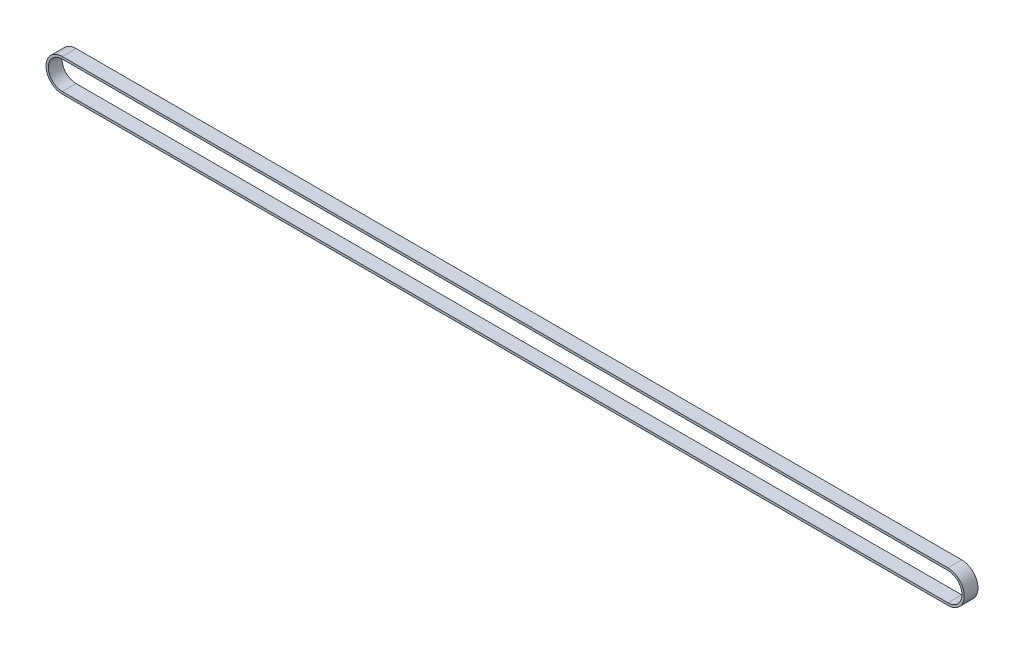
ISO-10303-21;
HEADER;
FILE_DESCRIPTION(('STEP AP214'),'2;1');
FILE_NAME('part.step','',(''),(''),'','','');
FILE_SCHEMA(('AUTOMOTIVE_DESIGN { 1 0 10303 214 1 1 1 1 }'));
ENDSEC;
DATA;
#1=APPLICATION_CONTEXT('core data for automotive mechanical design processes');
#2=APPLICATION_PROTOCOL_DEFINITION('international standard','automotive_design',2000,#1);
#3=PRODUCT_CONTEXT('',#1,'mechanical');
#4=PRODUCT('Part','Part','',(#3));
#5=PRODUCT_RELATED_PRODUCT_CATEGORY('part','',(#4));
#6=PRODUCT_DEFINITION_FORMATION('','',#4);
#7=PRODUCT_DEFINITION_CONTEXT('part definition',#1,'design');
#8=PRODUCT_DEFINITION('design','',#6,#7);
#9=PRODUCT_DEFINITION_SHAPE('','',#8);
#10=(LENGTH_UNIT() NAMED_UNIT(*) SI_UNIT(.MILLI.,.METRE.));
#11=(NAMED_UNIT(*) PLANE_ANGLE_UNIT() SI_UNIT($,.RADIAN.));
#12=(NAMED_UNIT(*) SI_UNIT($,.STERADIAN.) SOLID_ANGLE_UNIT());
#13=UNCERTAINTY_MEASURE_WITH_UNIT(LENGTH_MEASURE(1.E-05),#10,'distance_accuracy_value','');
#14=(GEOMETRIC_REPRESENTATION_CONTEXT(3) GLOBAL_UNCERTAINTY_ASSIGNED_CONTEXT((#13)) GLOBAL_UNIT_ASSIGNED_CONTEXT((#10,
#11,#12)) REPRESENTATION_CONTEXT('',''));
#15=CARTESIAN_POINT('',(0.,0.,0.));
#16=DIRECTION('',(0.,0.,1.));
#17=DIRECTION('',(1.,0.,0.));
#18=AXIS2_PLACEMENT_3D('',#15,#16,#17);
#19=CARTESIAN_POINT('',(0.,6.1,6.));
#20=DIRECTION('',(0.,1.,0.));
#21=DIRECTION('',(0.,0.,1.));
#22=AXIS2_PLACEMENT_3D('',#19,#20,#21);
#23=PLANE('',#22);
#24=DIRECTION('',(1.,0.,0.));
#25=VECTOR('',#24,1.);
#26=CARTESIAN_POINT('',(0.,6.1,0.));
#27=LINE('',#26,#25);
#28=CARTESIAN_POINT('',(0.,6.1,0.));
#29=VERTEX_POINT('',#28);
#30=CARTESIAN_POINT('',(385.75,6.1,0.));
#31=VERTEX_POINT('',#30);
#32=EDGE_CURVE('E113',#29,#31,#27,.T.);
#33=ORIENTED_EDGE('',*,*,#32,.T.);
#34=DIRECTION('',(0.,0.,-1.));
#35=VECTOR('',#34,1.);
#36=CARTESIAN_POINT('',(385.75,6.1,6.));
#37=LINE('',#36,#35);
#38=CARTESIAN_POINT('',(385.75,6.1,6.));
#39=VERTEX_POINT('',#38);
#40=EDGE_CURVE('E111',#39,#31,#37,.T.);
#41=ORIENTED_EDGE('',*,*,#40,.F.);
#42=DIRECTION('',(1.,0.,0.));
#43=VECTOR('',#42,1.);
#44=CARTESIAN_POINT('',(0.,6.1,6.));
#45=LINE('',#44,#43);
#46=CARTESIAN_POINT('',(0.,6.1,6.));
#47=VERTEX_POINT('',#46);
#48=EDGE_CURVE('E102',#47,#39,#45,.T.);
#49=ORIENTED_EDGE('',*,*,#48,.F.);
#50=DIRECTION('',(0.,0.,-1.));
#51=VECTOR('',#50,1.);
#52=CARTESIAN_POINT('',(0.,6.1,6.));
#53=LINE('',#52,#51);
#54=EDGE_CURVE('E148',#47,#29,#53,.T.);
#55=ORIENTED_EDGE('',*,*,#54,.T.);
#56=EDGE_LOOP('',(#33,#41,#49,#55));
#57=FACE_BOUND('',#56,.T.);
#58=ADVANCED_FACE('F32',(#57),#23,.F.);
#59=CARTESIAN_POINT('',(0.,7.1,6.));
#60=DIRECTION('',(0.,1.,0.));
#61=DIRECTION('',(0.,0.,1.));
#62=AXIS2_PLACEMENT_3D('',#59,#60,#61);
#63=PLANE('',#62);
#64=DIRECTION('',(1.,0.,0.));
#65=VECTOR('',#64,1.);
#66=CARTESIAN_POINT('',(0.,7.1,0.));
#67=LINE('',#66,#65);
#68=CARTESIAN_POINT('',(0.,7.1,0.));
#69=VERTEX_POINT('',#68);
#70=CARTESIAN_POINT('',(385.75,7.1,0.));
#71=VERTEX_POINT('',#70);
#72=EDGE_CURVE('E150',#69,#71,#67,.T.);
#73=ORIENTED_EDGE('',*,*,#72,.F.);
#74=DIRECTION('',(0.,0.,-1.));
#75=VECTOR('',#74,1.);
#76=CARTESIAN_POINT('',(0.,7.1,6.));
#77=LINE('',#76,#75);
#78=CARTESIAN_POINT('',(0.,7.1,6.));
#79=VERTEX_POINT('',#78);
#80=EDGE_CURVE('E11',#79,#69,#77,.T.);
#81=ORIENTED_EDGE('',*,*,#80,.F.);
#82=DIRECTION('',(1.,0.,0.));
#83=VECTOR('',#82,1.);
#84=CARTESIAN_POINT('',(0.,7.1,6.));
#85=LINE('',#84,#83);
#86=CARTESIAN_POINT('',(385.75,7.1,6.));
#87=VERTEX_POINT('',#86);
#88=EDGE_CURVE('E108',#79,#87,#85,.T.);
#89=ORIENTED_EDGE('',*,*,#88,.T.);
#90=DIRECTION('',(0.,0.,-1.));
#91=VECTOR('',#90,1.);
#92=CARTESIAN_POINT('',(385.75,7.1,6.));
#93=LINE('',#92,#91);
#94=EDGE_CURVE('E125',#87,#71,#93,.T.);
#95=ORIENTED_EDGE('',*,*,#94,.T.);
#96=EDGE_LOOP('',(#73,#81,#89,#95));
#97=FACE_BOUND('',#96,.T.);
#98=ADVANCED_FACE('F177',(#97),#63,.T.);
#99=CARTESIAN_POINT('',(0.,0.,6.));
#100=DIRECTION('',(0.,0.,-1.));
#101=DIRECTION('',(-1.,0.,0.));
#102=AXIS2_PLACEMENT_3D('',#99,#100,#101);
#103=CYLINDRICAL_SURFACE('',#102,7.1);
#104=CARTESIAN_POINT('',(0.,0.,0.));
#105=DIRECTION('',(0.,0.,1.));
#106=DIRECTION('',(1.,0.,0.));
#107=AXIS2_PLACEMENT_3D('',#104,#105,#106);
#108=CIRCLE('',#107,7.1);
#109=CARTESIAN_POINT('',(0.,-7.1,0.));
#110=VERTEX_POINT('',#109);
#111=EDGE_CURVE('E152',#110,#69,#108,.F.);
#112=ORIENTED_EDGE('',*,*,#111,.F.);
#113=DIRECTION('',(0.,0.,-1.));
#114=VECTOR('',#113,1.);
#115=CARTESIAN_POINT('',(0.,-7.1,6.));
#116=LINE('',#115,#114);
#117=CARTESIAN_POINT('',(0.,-7.1,6.));
#118=VERTEX_POINT('',#117);
#119=EDGE_CURVE('E40',#118,#110,#116,.T.);
#120=ORIENTED_EDGE('',*,*,#119,.F.);
#121=CARTESIAN_POINT('',(0.,0.,6.));
#122=DIRECTION('',(0.,0.,1.));
#123=DIRECTION('',(1.,0.,0.));
#124=AXIS2_PLACEMENT_3D('',#121,#122,#123);
#125=CIRCLE('',#124,7.1);
#126=EDGE_CURVE('E139',#118,#79,#125,.F.);
#127=ORIENTED_EDGE('',*,*,#126,.T.);
#128=ORIENTED_EDGE('',*,*,#80,.T.);
#129=EDGE_LOOP('',(#112,#120,#127,#128));
#130=FACE_BOUND('',#129,.T.);
#131=ADVANCED_FACE('F168',(#130),#103,.T.);
#132=CARTESIAN_POINT('',(192.875,-7.09999999999998,6.));
#133=DIRECTION('',(0.,-1.,0.));
#134=DIRECTION('',(1.,0.,0.));
#135=AXIS2_PLACEMENT_3D('',#132,#133,#134);
#136=PLANE('',#135);
#137=DIRECTION('',(-1.,0.,0.));
#138=VECTOR('',#137,1.);
#139=CARTESIAN_POINT('',(192.875,-7.09999999999998,0.));
#140=LINE('',#139,#138);
#141=CARTESIAN_POINT('',(385.75,-7.1,0.));
#142=VERTEX_POINT('',#141);
#143=EDGE_CURVE('E155',#142,#110,#140,.T.);
#144=ORIENTED_EDGE('',*,*,#143,.F.);
#145=DIRECTION('',(0.,0.,-1.));
#146=VECTOR('',#145,1.);
#147=CARTESIAN_POINT('',(385.75,-7.1,6.));
#148=LINE('',#147,#146);
#149=CARTESIAN_POINT('',(385.75,-7.1,6.));
#150=VERTEX_POINT('',#149);
#151=EDGE_CURVE('E134',#150,#142,#148,.T.);
#152=ORIENTED_EDGE('',*,*,#151,.F.);
#153=DIRECTION('',(-1.,0.,0.));
#154=VECTOR('',#153,1.);
#155=CARTESIAN_POINT('',(192.875,-7.09999999999998,6.));
#156=LINE('',#155,#154);
#157=EDGE_CURVE('E142',#150,#118,#156,.T.);
#158=ORIENTED_EDGE('',*,*,#157,.T.);
#159=ORIENTED_EDGE('',*,*,#119,.T.);
#160=EDGE_LOOP('',(#144,#152,#158,#159));
#161=FACE_BOUND('',#160,.T.);
#162=ADVANCED_FACE('F164',(#161),#136,.T.);
#163=CARTESIAN_POINT('',(192.875,-6.09999999999998,6.));
#164=DIRECTION('',(0.,-1.,0.));
#165=DIRECTION('',(1.,0.,0.));
#166=AXIS2_PLACEMENT_3D('',#163,#164,#165);
#167=PLANE('',#166);
#168=DIRECTION('',(-1.,0.,0.));
#169=VECTOR('',#168,1.);
#170=CARTESIAN_POINT('',(192.875,-6.09999999999998,0.));
#171=LINE('',#170,#169);
#172=CARTESIAN_POINT('',(385.75,-6.1,0.));
#173=VERTEX_POINT('',#172);
#174=CARTESIAN_POINT('',(0.,-6.1,0.));
#175=VERTEX_POINT('',#174);
#176=EDGE_CURVE('E65',#173,#175,#171,.T.);
#177=ORIENTED_EDGE('',*,*,#176,.T.);
#178=DIRECTION('',(0.,0.,-1.));
#179=VECTOR('',#178,1.);
#180=CARTESIAN_POINT('',(0.,-6.1,6.));
#181=LINE('',#180,#179);
#182=CARTESIAN_POINT('',(0.,-6.1,6.));
#183=VERTEX_POINT('',#182);
#184=EDGE_CURVE('E161',#183,#175,#181,.T.);
#185=ORIENTED_EDGE('',*,*,#184,.F.);
#186=DIRECTION('',(-1.,0.,0.));
#187=VECTOR('',#186,1.);
#188=CARTESIAN_POINT('',(192.875,-6.09999999999998,6.));
#189=LINE('',#188,#187);
#190=CARTESIAN_POINT('',(385.75,-6.1,6.));
#191=VERTEX_POINT('',#190);
#192=EDGE_CURVE('E145',#191,#183,#189,.T.);
#193=ORIENTED_EDGE('',*,*,#192,.F.);
#194=DIRECTION('',(0.,0.,-1.));
#195=VECTOR('',#194,1.);
#196=CARTESIAN_POINT('',(385.75,-6.1,6.));
#197=LINE('',#196,#195);
#198=EDGE_CURVE('E117',#191,#173,#197,.T.);
#199=ORIENTED_EDGE('',*,*,#198,.T.);
#200=EDGE_LOOP('',(#177,#185,#193,#199));
#201=FACE_BOUND('',#200,.T.);
#202=ADVANCED_FACE('F187',(#201),#167,.F.);
#203=CARTESIAN_POINT('',(0.,0.,6.));
#204=DIRECTION('',(0.,0.,-1.));
#205=DIRECTION('',(-1.,0.,0.));
#206=AXIS2_PLACEMENT_3D('',#203,#204,#205);
#207=CYLINDRICAL_SURFACE('',#206,6.1);
#208=CARTESIAN_POINT('',(0.,0.,0.));
#209=DIRECTION('',(0.,0.,-1.));
#210=DIRECTION('',(-1.,0.,0.));
#211=AXIS2_PLACEMENT_3D('',#208,#209,#210);
#212=CIRCLE('',#211,6.1);
#213=EDGE_CURVE('E71',#175,#29,#212,.T.);
#214=ORIENTED_EDGE('',*,*,#213,.T.);
#215=ORIENTED_EDGE('',*,*,#54,.F.);
#216=CARTESIAN_POINT('',(0.,0.,6.));
#217=DIRECTION('',(0.,0.,-1.));
#218=DIRECTION('',(-1.,0.,0.));
#219=AXIS2_PLACEMENT_3D('',#216,#217,#218);
#220=CIRCLE('',#219,6.1);
#221=EDGE_CURVE('E48',#183,#47,#220,.T.);
#222=ORIENTED_EDGE('',*,*,#221,.F.);
#223=ORIENTED_EDGE('',*,*,#184,.T.);
#224=EDGE_LOOP('',(#214,#215,#222,#223));
#225=FACE_BOUND('',#224,.T.);
#226=ADVANCED_FACE('F180',(#225),#207,.F.);
#227=CARTESIAN_POINT('',(0.,0.,6.));
#228=DIRECTION('',(0.,0.,1.));
#229=DIRECTION('',(1.,0.,0.));
#230=AXIS2_PLACEMENT_3D('',#227,#228,#229);
#231=PLANE('',#230);
#232=ORIENTED_EDGE('',*,*,#157,.F.);
#233=CARTESIAN_POINT('',(385.75,0.,6.));
#234=DIRECTION('',(0.,0.,-1.));
#235=DIRECTION('',(-1.,0.,0.));
#236=AXIS2_PLACEMENT_3D('',#233,#234,#235);
#237=CIRCLE('',#236,7.1);
#238=EDGE_CURVE('E121',#150,#87,#237,.F.);
#239=ORIENTED_EDGE('',*,*,#238,.T.);
#240=ORIENTED_EDGE('',*,*,#88,.F.);
#241=ORIENTED_EDGE('',*,*,#126,.F.);
#242=EDGE_LOOP('',(#232,#239,#240,#241));
#243=FACE_BOUND('',#242,.T.);
#244=ORIENTED_EDGE('',*,*,#48,.T.);
#245=CARTESIAN_POINT('',(385.75,0.,6.));
#246=DIRECTION('',(0.,0.,1.));
#247=DIRECTION('',(1.,0.,0.));
#248=AXIS2_PLACEMENT_3D('',#245,#246,#247);
#249=CIRCLE('',#248,6.1);
#250=EDGE_CURVE('E106',#191,#39,#249,.T.);
#251=ORIENTED_EDGE('',*,*,#250,.F.);
#252=ORIENTED_EDGE('',*,*,#192,.T.);
#253=ORIENTED_EDGE('',*,*,#221,.T.);
#254=EDGE_LOOP('',(#244,#251,#252,#253));
#255=FACE_BOUND('',#254,.T.);
#256=ADVANCED_FACE('F104',(#243,#255),#231,.T.);
#257=CARTESIAN_POINT('',(0.,0.,0.));
#258=DIRECTION('',(0.,0.,1.));
#259=DIRECTION('',(1.,0.,0.));
#260=AXIS2_PLACEMENT_3D('',#257,#258,#259);
#261=PLANE('',#260);
#262=CARTESIAN_POINT('',(385.75,0.,0.));
#263=DIRECTION('',(0.,0.,-1.));
#264=DIRECTION('',(-1.,0.,0.));
#265=AXIS2_PLACEMENT_3D('',#262,#263,#264);
#266=CIRCLE('',#265,7.1);
#267=EDGE_CURVE('E122',#142,#71,#266,.F.);
#268=ORIENTED_EDGE('',*,*,#267,.F.);
#269=ORIENTED_EDGE('',*,*,#143,.T.);
#270=ORIENTED_EDGE('',*,*,#111,.T.);
#271=ORIENTED_EDGE('',*,*,#72,.T.);
#272=EDGE_LOOP('',(#268,#269,#270,#271));
#273=FACE_BOUND('',#272,.T.);
#274=ORIENTED_EDGE('',*,*,#32,.F.);
#275=ORIENTED_EDGE('',*,*,#213,.F.);
#276=ORIENTED_EDGE('',*,*,#176,.F.);
#277=CARTESIAN_POINT('',(385.75,0.,0.));
#278=DIRECTION('',(0.,0.,1.));
#279=DIRECTION('',(1.,0.,0.));
#280=AXIS2_PLACEMENT_3D('',#277,#278,#279);
#281=CIRCLE('',#280,6.1);
#282=EDGE_CURVE('E128',#173,#31,#281,.T.);
#283=ORIENTED_EDGE('',*,*,#282,.T.);
#284=EDGE_LOOP('',(#274,#275,#276,#283));
#285=FACE_BOUND('',#284,.T.);
#286=ADVANCED_FACE('F171',(#273,#285),#261,.F.);
#287=CARTESIAN_POINT('',(385.75,0.,6.));
#288=DIRECTION('',(0.,0.,-1.));
#289=DIRECTION('',(-1.,0.,0.));
#290=AXIS2_PLACEMENT_3D('',#287,#288,#289);
#291=CYLINDRICAL_SURFACE('',#290,6.1);
#292=ORIENTED_EDGE('',*,*,#282,.F.);
#293=ORIENTED_EDGE('',*,*,#198,.F.);
#294=ORIENTED_EDGE('',*,*,#250,.T.);
#295=ORIENTED_EDGE('',*,*,#40,.T.);
#296=EDGE_LOOP('',(#292,#293,#294,#295));
#297=FACE_BOUND('',#296,.T.);
#298=ADVANCED_FACE('F120',(#297),#291,.F.);
#299=CARTESIAN_POINT('',(385.75,0.,6.));
#300=DIRECTION('',(0.,0.,-1.));
#301=DIRECTION('',(-1.,0.,0.));
#302=AXIS2_PLACEMENT_3D('',#299,#300,#301);
#303=CYLINDRICAL_SURFACE('',#302,7.1);
#304=ORIENTED_EDGE('',*,*,#267,.T.);
#305=ORIENTED_EDGE('',*,*,#94,.F.);
#306=ORIENTED_EDGE('',*,*,#238,.F.);
#307=ORIENTED_EDGE('',*,*,#151,.T.);
#308=EDGE_LOOP('',(#304,#305,#306,#307));
#309=FACE_BOUND('',#308,.T.);
#310=ADVANCED_FACE('F175',(#309),#303,.T.);
#311=CLOSED_SHELL('',(#58,#98,#131,#162,#202,#226,#256,#286,#298,#310));
#312=MANIFOLD_SOLID_BREP('B2',#311);
#313=ADVANCED_BREP_SHAPE_REPRESENTATION('',(#18,#312),#14);
#314=SHAPE_DEFINITION_REPRESENTATION(#9,#313);
ENDSEC;
END-ISO-10303-21;
